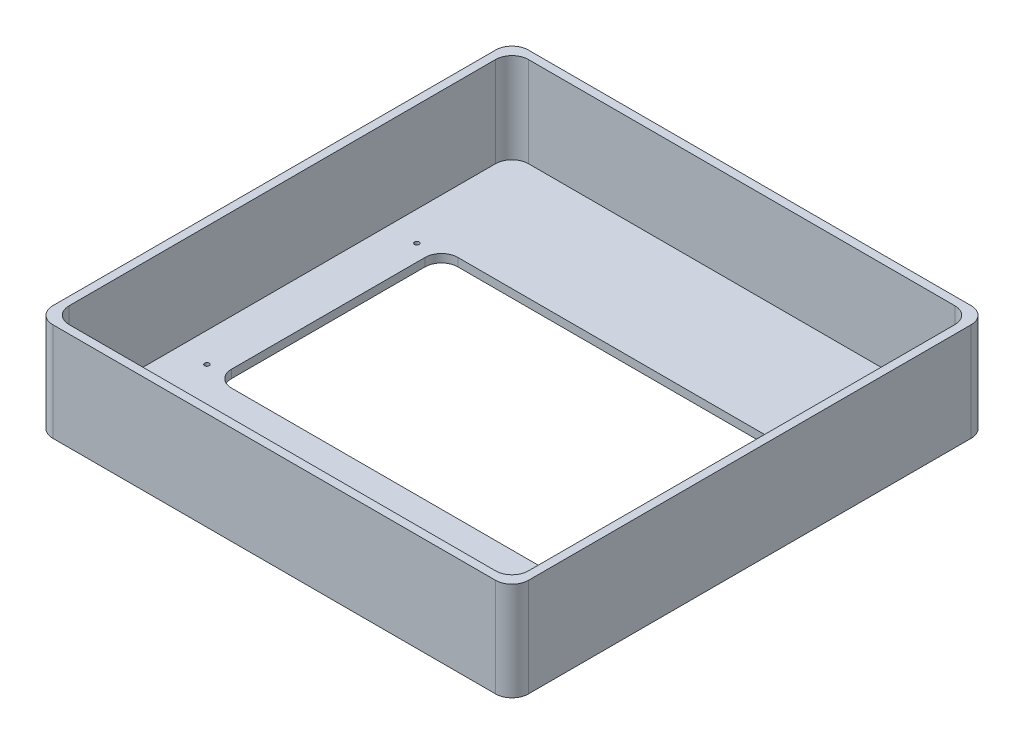
ISO-10303-21;
HEADER;
FILE_DESCRIPTION(('STEP AP214'),'2;1');
FILE_NAME('part.step','',(''),(''),'','','');
FILE_SCHEMA(('AUTOMOTIVE_DESIGN { 1 0 10303 214 1 1 1 1 }'));
ENDSEC;
DATA;
#1=APPLICATION_CONTEXT('core data for automotive mechanical design processes');
#2=APPLICATION_PROTOCOL_DEFINITION('international standard','automotive_design',2000,#1);
#3=PRODUCT_CONTEXT('',#1,'mechanical');
#4=PRODUCT('Part','Part','',(#3));
#5=PRODUCT_RELATED_PRODUCT_CATEGORY('part','',(#4));
#6=PRODUCT_DEFINITION_FORMATION('','',#4);
#7=PRODUCT_DEFINITION_CONTEXT('part definition',#1,'design');
#8=PRODUCT_DEFINITION('design','',#6,#7);
#9=PRODUCT_DEFINITION_SHAPE('','',#8);
#10=(LENGTH_UNIT() NAMED_UNIT(*) SI_UNIT(.MILLI.,.METRE.));
#11=(NAMED_UNIT(*) PLANE_ANGLE_UNIT() SI_UNIT($,.RADIAN.));
#12=(NAMED_UNIT(*) SI_UNIT($,.STERADIAN.) SOLID_ANGLE_UNIT());
#13=UNCERTAINTY_MEASURE_WITH_UNIT(LENGTH_MEASURE(1.E-05),#10,'distance_accuracy_value','');
#14=(GEOMETRIC_REPRESENTATION_CONTEXT(3) GLOBAL_UNCERTAINTY_ASSIGNED_CONTEXT((#13)) GLOBAL_UNIT_ASSIGNED_CONTEXT((#10,
#11,#12)) REPRESENTATION_CONTEXT('',''));
#15=CARTESIAN_POINT('',(0.,0.,0.));
#16=DIRECTION('',(0.,0.,1.));
#17=DIRECTION('',(1.,0.,0.));
#18=AXIS2_PLACEMENT_3D('',#15,#16,#17);
#19=CARTESIAN_POINT('',(0.,5.,0.));
#20=DIRECTION('',(0.,-1.,0.));
#21=DIRECTION('',(0.,0.,-1.));
#22=AXIS2_PLACEMENT_3D('',#19,#20,#21);
#23=PLANE('',#22);
#24=CARTESIAN_POINT('',(-122.,5.,-64.));
#25=DIRECTION('',(0.,-1.,0.));
#26=DIRECTION('',(0.,0.,-1.));
#27=AXIS2_PLACEMENT_3D('',#24,#25,#26);
#28=CIRCLE('',#27,1.4);
#29=CARTESIAN_POINT('',(-122.,5.,-65.4));
#30=VERTEX_POINT('',#29);
#31=EDGE_CURVE('E583',#30,#30,#28,.F.);
#32=ORIENTED_EDGE('',*,*,#31,.F.);
#33=EDGE_LOOP('',(#32));
#34=FACE_BOUND('',#33,.T.);
#35=CARTESIAN_POINT('',(122.,5.,-64.));
#36=DIRECTION('',(0.,-1.,0.));
#37=DIRECTION('',(0.,0.,-1.));
#38=AXIS2_PLACEMENT_3D('',#35,#36,#37);
#39=CIRCLE('',#38,1.4);
#40=CARTESIAN_POINT('',(122.,5.,-65.4));
#41=VERTEX_POINT('',#40);
#42=EDGE_CURVE('E582',#41,#41,#39,.F.);
#43=ORIENTED_EDGE('',*,*,#42,.F.);
#44=EDGE_LOOP('',(#43));
#45=FACE_BOUND('',#44,.T.);
#46=CARTESIAN_POINT('',(122.,5.,64.));
#47=DIRECTION('',(0.,-1.,0.));
#48=DIRECTION('',(0.,0.,-1.));
#49=AXIS2_PLACEMENT_3D('',#46,#47,#48);
#50=CIRCLE('',#49,1.4);
#51=CARTESIAN_POINT('',(122.,5.,62.6));
#52=VERTEX_POINT('',#51);
#53=EDGE_CURVE('E591',#52,#52,#50,.F.);
#54=ORIENTED_EDGE('',*,*,#53,.F.);
#55=EDGE_LOOP('',(#54));
#56=FACE_BOUND('',#55,.T.);
#57=CARTESIAN_POINT('',(-122.,5.,64.));
#58=DIRECTION('',(0.,-1.,0.));
#59=DIRECTION('',(0.,0.,-1.));
#60=AXIS2_PLACEMENT_3D('',#57,#58,#59);
#61=CIRCLE('',#60,1.4);
#62=CARTESIAN_POINT('',(-122.,5.,62.6));
#63=VERTEX_POINT('',#62);
#64=EDGE_CURVE('E397',#63,#63,#61,.F.);
#65=ORIENTED_EDGE('',*,*,#64,.F.);
#66=EDGE_LOOP('',(#65));
#67=FACE_BOUND('',#66,.T.);
#68=DIRECTION('',(-1.,0.,0.));
#69=VECTOR('',#68,1.);
#70=CARTESIAN_POINT('',(140.,5.,-140.));
#71=LINE('',#70,#69);
#72=CARTESIAN_POINT('',(130.,5.,-140.));
#73=VERTEX_POINT('',#72);
#74=CARTESIAN_POINT('',(-130.,5.,-140.));
#75=VERTEX_POINT('',#74);
#76=EDGE_CURVE('E446',#73,#75,#71,.T.);
#77=ORIENTED_EDGE('',*,*,#76,.T.);
#78=CARTESIAN_POINT('',(-130.,5.,-130.));
#79=DIRECTION('',(0.,-1.,0.));
#80=DIRECTION('',(0.,0.,-1.));
#81=AXIS2_PLACEMENT_3D('',#78,#79,#80);
#82=CIRCLE('',#81,10.);
#83=CARTESIAN_POINT('',(-140.,5.,-130.));
#84=VERTEX_POINT('',#83);
#85=EDGE_CURVE('E299',#75,#84,#82,.F.);
#86=ORIENTED_EDGE('',*,*,#85,.T.);
#87=DIRECTION('',(0.,0.,1.));
#88=VECTOR('',#87,1.);
#89=CARTESIAN_POINT('',(-140.,5.,-140.));
#90=LINE('',#89,#88);
#91=CARTESIAN_POINT('',(-140.,5.,130.));
#92=VERTEX_POINT('',#91);
#93=EDGE_CURVE('E451',#84,#92,#90,.T.);
#94=ORIENTED_EDGE('',*,*,#93,.T.);
#95=CARTESIAN_POINT('',(-130.,5.,130.));
#96=DIRECTION('',(0.,-1.,0.));
#97=DIRECTION('',(0.,0.,-1.));
#98=AXIS2_PLACEMENT_3D('',#95,#96,#97);
#99=CIRCLE('',#98,10.);
#100=CARTESIAN_POINT('',(-130.,5.,140.));
#101=VERTEX_POINT('',#100);
#102=EDGE_CURVE('E290',#92,#101,#99,.F.);
#103=ORIENTED_EDGE('',*,*,#102,.T.);
#104=DIRECTION('',(1.,0.,0.));
#105=VECTOR('',#104,1.);
#106=CARTESIAN_POINT('',(-140.,5.,140.));
#107=LINE('',#106,#105);
#108=CARTESIAN_POINT('',(130.,5.,140.));
#109=VERTEX_POINT('',#108);
#110=EDGE_CURVE('E447',#101,#109,#107,.T.);
#111=ORIENTED_EDGE('',*,*,#110,.T.);
#112=CARTESIAN_POINT('',(130.,5.,130.));
#113=DIRECTION('',(0.,-1.,0.));
#114=DIRECTION('',(0.,0.,-1.));
#115=AXIS2_PLACEMENT_3D('',#112,#113,#114);
#116=CIRCLE('',#115,10.);
#117=CARTESIAN_POINT('',(140.,5.,130.));
#118=VERTEX_POINT('',#117);
#119=EDGE_CURVE('E293',#109,#118,#116,.F.);
#120=ORIENTED_EDGE('',*,*,#119,.T.);
#121=DIRECTION('',(0.,0.,-1.));
#122=VECTOR('',#121,1.);
#123=CARTESIAN_POINT('',(140.,5.,140.));
#124=LINE('',#123,#122);
#125=CARTESIAN_POINT('',(140.,5.,-130.));
#126=VERTEX_POINT('',#125);
#127=EDGE_CURVE('E431',#118,#126,#124,.T.);
#128=ORIENTED_EDGE('',*,*,#127,.T.);
#129=CARTESIAN_POINT('',(130.,5.,-130.));
#130=DIRECTION('',(0.,-1.,0.));
#131=DIRECTION('',(0.,0.,-1.));
#132=AXIS2_PLACEMENT_3D('',#129,#130,#131);
#133=CIRCLE('',#132,10.);
#134=EDGE_CURVE('E296',#126,#73,#133,.F.);
#135=ORIENTED_EDGE('',*,*,#134,.T.);
#136=EDGE_LOOP('',(#77,#86,#94,#103,#111,#120,#128,#135));
#137=FACE_BOUND('',#136,.T.);
#138=DIRECTION('',(0.,0.,-1.));
#139=VECTOR('',#138,1.);
#140=CARTESIAN_POINT('',(112.,5.,69.));
#141=LINE('',#140,#139);
#142=CARTESIAN_POINT('',(112.,5.,59.));
#143=VERTEX_POINT('',#142);
#144=CARTESIAN_POINT('',(112.,5.,-59.));
#145=VERTEX_POINT('',#144);
#146=EDGE_CURVE('E389',#143,#145,#141,.T.);
#147=ORIENTED_EDGE('',*,*,#146,.F.);
#148=CARTESIAN_POINT('',(102.,5.,59.));
#149=DIRECTION('',(0.,-1.,0.));
#150=DIRECTION('',(0.,0.,-1.));
#151=AXIS2_PLACEMENT_3D('',#148,#149,#150);
#152=CIRCLE('',#151,10.);
#153=CARTESIAN_POINT('',(102.,5.,69.));
#154=VERTEX_POINT('',#153);
#155=EDGE_CURVE('E381',#143,#154,#152,.T.);
#156=ORIENTED_EDGE('',*,*,#155,.T.);
#157=DIRECTION('',(1.,0.,0.));
#158=VECTOR('',#157,1.);
#159=CARTESIAN_POINT('',(-112.,5.,69.));
#160=LINE('',#159,#158);
#161=CARTESIAN_POINT('',(-102.,5.,69.));
#162=VERTEX_POINT('',#161);
#163=EDGE_CURVE('E410',#162,#154,#160,.T.);
#164=ORIENTED_EDGE('',*,*,#163,.F.);
#165=CARTESIAN_POINT('',(-102.,5.,59.));
#166=DIRECTION('',(0.,-1.,0.));
#167=DIRECTION('',(0.,0.,-1.));
#168=AXIS2_PLACEMENT_3D('',#165,#166,#167);
#169=CIRCLE('',#168,10.);
#170=CARTESIAN_POINT('',(-112.,5.,59.));
#171=VERTEX_POINT('',#170);
#172=EDGE_CURVE('E375',#162,#171,#169,.T.);
#173=ORIENTED_EDGE('',*,*,#172,.T.);
#174=DIRECTION('',(0.,0.,1.));
#175=VECTOR('',#174,1.);
#176=CARTESIAN_POINT('',(-112.,5.,69.));
#177=LINE('',#176,#175);
#178=CARTESIAN_POINT('',(-112.,5.,-59.));
#179=VERTEX_POINT('',#178);
#180=EDGE_CURVE('E418',#179,#171,#177,.T.);
#181=ORIENTED_EDGE('',*,*,#180,.F.);
#182=CARTESIAN_POINT('',(-102.,5.,-59.));
#183=DIRECTION('',(0.,-1.,0.));
#184=DIRECTION('',(0.,0.,-1.));
#185=AXIS2_PLACEMENT_3D('',#182,#183,#184);
#186=CIRCLE('',#185,10.);
#187=CARTESIAN_POINT('',(-102.,5.,-69.));
#188=VERTEX_POINT('',#187);
#189=EDGE_CURVE('E369',#179,#188,#186,.T.);
#190=ORIENTED_EDGE('',*,*,#189,.T.);
#191=DIRECTION('',(-1.,0.,0.));
#192=VECTOR('',#191,1.);
#193=CARTESIAN_POINT('',(-112.,5.,-69.));
#194=LINE('',#193,#192);
#195=CARTESIAN_POINT('',(102.,5.,-69.));
#196=VERTEX_POINT('',#195);
#197=EDGE_CURVE('E391',#196,#188,#194,.T.);
#198=ORIENTED_EDGE('',*,*,#197,.F.);
#199=CARTESIAN_POINT('',(102.,5.,-59.));
#200=DIRECTION('',(0.,-1.,0.));
#201=DIRECTION('',(0.,0.,-1.));
#202=AXIS2_PLACEMENT_3D('',#199,#200,#201);
#203=CIRCLE('',#202,10.);
#204=EDGE_CURVE('E54',#196,#145,#203,.T.);
#205=ORIENTED_EDGE('',*,*,#204,.T.);
#206=EDGE_LOOP('',(#147,#156,#164,#173,#181,#190,#198,#205));
#207=FACE_BOUND('',#206,.T.);
#208=ADVANCED_FACE('F45',(#34,#45,#56,#67,#137,#207),#23,.F.);
#209=CARTESIAN_POINT('',(145.,60.,145.));
#210=DIRECTION('',(-1.,0.,0.));
#211=DIRECTION('',(0.,0.,1.));
#212=AXIS2_PLACEMENT_3D('',#209,#210,#211);
#213=PLANE('',#212);
#214=DIRECTION('',(0.,0.,-1.));
#215=VECTOR('',#214,1.);
#216=CARTESIAN_POINT('',(145.,0.,145.));
#217=LINE('',#216,#215);
#218=CARTESIAN_POINT('',(145.,0.,135.));
#219=VERTEX_POINT('',#218);
#220=CARTESIAN_POINT('',(145.,0.,-135.));
#221=VERTEX_POINT('',#220);
#222=EDGE_CURVE('E245',#219,#221,#217,.T.);
#223=ORIENTED_EDGE('',*,*,#222,.T.);
#224=DIRECTION('',(0.,-1.,0.));
#225=VECTOR('',#224,1.);
#226=CARTESIAN_POINT('',(145.,60.,-135.));
#227=LINE('',#226,#225);
#228=CARTESIAN_POINT('',(145.,60.,-135.));
#229=VERTEX_POINT('',#228);
#230=EDGE_CURVE('E306',#221,#229,#227,.F.);
#231=ORIENTED_EDGE('',*,*,#230,.T.);
#232=DIRECTION('',(0.,0.,-1.));
#233=VECTOR('',#232,1.);
#234=CARTESIAN_POINT('',(145.,60.,145.));
#235=LINE('',#234,#233);
#236=CARTESIAN_POINT('',(145.,60.,135.));
#237=VERTEX_POINT('',#236);
#238=EDGE_CURVE('E243',#237,#229,#235,.T.);
#239=ORIENTED_EDGE('',*,*,#238,.F.);
#240=DIRECTION('',(0.,-1.,0.));
#241=VECTOR('',#240,1.);
#242=CARTESIAN_POINT('',(145.,60.,135.));
#243=LINE('',#242,#241);
#244=EDGE_CURVE('E302',#237,#219,#243,.T.);
#245=ORIENTED_EDGE('',*,*,#244,.T.);
#246=EDGE_LOOP('',(#223,#231,#239,#245));
#247=FACE_BOUND('',#246,.T.);
#248=ADVANCED_FACE('F474',(#247),#213,.F.);
#249=CARTESIAN_POINT('',(-145.,60.,-145.));
#250=DIRECTION('',(0.,0.,1.));
#251=DIRECTION('',(1.,0.,0.));
#252=AXIS2_PLACEMENT_3D('',#249,#250,#251);
#253=PLANE('',#252);
#254=DIRECTION('',(-1.,0.,0.));
#255=VECTOR('',#254,1.);
#256=CARTESIAN_POINT('',(-145.,0.,-145.));
#257=LINE('',#256,#255);
#258=CARTESIAN_POINT('',(135.,0.,-145.));
#259=VERTEX_POINT('',#258);
#260=CARTESIAN_POINT('',(-135.,0.,-145.));
#261=VERTEX_POINT('',#260);
#262=EDGE_CURVE('E238',#259,#261,#257,.T.);
#263=ORIENTED_EDGE('',*,*,#262,.T.);
#264=DIRECTION('',(0.,-1.,0.));
#265=VECTOR('',#264,1.);
#266=CARTESIAN_POINT('',(-135.,60.,-145.));
#267=LINE('',#266,#265);
#268=CARTESIAN_POINT('',(-135.,60.,-145.));
#269=VERTEX_POINT('',#268);
#270=EDGE_CURVE('E213',#261,#269,#267,.F.);
#271=ORIENTED_EDGE('',*,*,#270,.T.);
#272=DIRECTION('',(-1.,0.,0.));
#273=VECTOR('',#272,1.);
#274=CARTESIAN_POINT('',(-145.,60.,-145.));
#275=LINE('',#274,#273);
#276=CARTESIAN_POINT('',(135.,60.,-145.));
#277=VERTEX_POINT('',#276);
#278=EDGE_CURVE('E461',#277,#269,#275,.T.);
#279=ORIENTED_EDGE('',*,*,#278,.F.);
#280=DIRECTION('',(0.,-1.,0.));
#281=VECTOR('',#280,1.);
#282=CARTESIAN_POINT('',(135.,60.,-145.));
#283=LINE('',#282,#281);
#284=EDGE_CURVE('E219',#277,#259,#283,.T.);
#285=ORIENTED_EDGE('',*,*,#284,.T.);
#286=EDGE_LOOP('',(#263,#271,#279,#285));
#287=FACE_BOUND('',#286,.T.);
#288=ADVANCED_FACE('F485',(#287),#253,.F.);
#289=CARTESIAN_POINT('',(-145.,60.,145.));
#290=DIRECTION('',(1.,0.,0.));
#291=DIRECTION('',(0.,0.,-1.));
#292=AXIS2_PLACEMENT_3D('',#289,#290,#291);
#293=PLANE('',#292);
#294=DIRECTION('',(0.,0.,1.));
#295=VECTOR('',#294,1.);
#296=CARTESIAN_POINT('',(-145.,60.,145.));
#297=LINE('',#296,#295);
#298=CARTESIAN_POINT('',(-145.,60.,-135.));
#299=VERTEX_POINT('',#298);
#300=CARTESIAN_POINT('',(-145.,60.,135.));
#301=VERTEX_POINT('',#300);
#302=EDGE_CURVE('E229',#299,#301,#297,.T.);
#303=ORIENTED_EDGE('',*,*,#302,.F.);
#304=DIRECTION('',(0.,-1.,0.));
#305=VECTOR('',#304,1.);
#306=CARTESIAN_POINT('',(-145.,60.,-135.));
#307=LINE('',#306,#305);
#308=CARTESIAN_POINT('',(-145.,0.,-135.));
#309=VERTEX_POINT('',#308);
#310=EDGE_CURVE('E212',#299,#309,#307,.T.);
#311=ORIENTED_EDGE('',*,*,#310,.T.);
#312=DIRECTION('',(0.,0.,1.));
#313=VECTOR('',#312,1.);
#314=CARTESIAN_POINT('',(-145.,0.,145.));
#315=LINE('',#314,#313);
#316=CARTESIAN_POINT('',(-145.,0.,135.));
#317=VERTEX_POINT('',#316);
#318=EDGE_CURVE('E226',#309,#317,#315,.T.);
#319=ORIENTED_EDGE('',*,*,#318,.T.);
#320=DIRECTION('',(0.,-1.,0.));
#321=VECTOR('',#320,1.);
#322=CARTESIAN_POINT('',(-145.,60.,135.));
#323=LINE('',#322,#321);
#324=EDGE_CURVE('E232',#317,#301,#323,.F.);
#325=ORIENTED_EDGE('',*,*,#324,.T.);
#326=EDGE_LOOP('',(#303,#311,#319,#325));
#327=FACE_BOUND('',#326,.T.);
#328=ADVANCED_FACE('F225',(#327),#293,.F.);
#329=CARTESIAN_POINT('',(-145.,60.,145.));
#330=DIRECTION('',(0.,0.,-1.));
#331=DIRECTION('',(-1.,0.,0.));
#332=AXIS2_PLACEMENT_3D('',#329,#330,#331);
#333=PLANE('',#332);
#334=DIRECTION('',(1.,0.,0.));
#335=VECTOR('',#334,1.);
#336=CARTESIAN_POINT('',(-145.,0.,145.));
#337=LINE('',#336,#335);
#338=CARTESIAN_POINT('',(-135.,0.,145.));
#339=VERTEX_POINT('',#338);
#340=CARTESIAN_POINT('',(135.,0.,145.));
#341=VERTEX_POINT('',#340);
#342=EDGE_CURVE('E237',#339,#341,#337,.T.);
#343=ORIENTED_EDGE('',*,*,#342,.T.);
#344=DIRECTION('',(0.,-1.,0.));
#345=VECTOR('',#344,1.);
#346=CARTESIAN_POINT('',(135.,60.,145.));
#347=LINE('',#346,#345);
#348=CARTESIAN_POINT('',(135.,60.,145.));
#349=VERTEX_POINT('',#348);
#350=EDGE_CURVE('E320',#341,#349,#347,.F.);
#351=ORIENTED_EDGE('',*,*,#350,.T.);
#352=DIRECTION('',(1.,0.,0.));
#353=VECTOR('',#352,1.);
#354=CARTESIAN_POINT('',(-145.,60.,145.));
#355=LINE('',#354,#353);
#356=CARTESIAN_POINT('',(-135.,60.,145.));
#357=VERTEX_POINT('',#356);
#358=EDGE_CURVE('E250',#357,#349,#355,.T.);
#359=ORIENTED_EDGE('',*,*,#358,.F.);
#360=DIRECTION('',(0.,-1.,0.));
#361=VECTOR('',#360,1.);
#362=CARTESIAN_POINT('',(-135.,60.,145.));
#363=LINE('',#362,#361);
#364=EDGE_CURVE('E316',#357,#339,#363,.T.);
#365=ORIENTED_EDGE('',*,*,#364,.T.);
#366=EDGE_LOOP('',(#343,#351,#359,#365));
#367=FACE_BOUND('',#366,.T.);
#368=ADVANCED_FACE('F492',(#367),#333,.F.);
#369=CARTESIAN_POINT('',(0.,60.,0.));
#370=DIRECTION('',(0.,-1.,0.));
#371=DIRECTION('',(0.,0.,-1.));
#372=AXIS2_PLACEMENT_3D('',#369,#370,#371);
#373=PLANE('',#372);
#374=DIRECTION('',(-1.,0.,0.));
#375=VECTOR('',#374,1.);
#376=CARTESIAN_POINT('',(140.,60.,-140.));
#377=LINE('',#376,#375);
#378=CARTESIAN_POINT('',(130.,60.,-140.));
#379=VERTEX_POINT('',#378);
#380=CARTESIAN_POINT('',(-130.,60.,-140.));
#381=VERTEX_POINT('',#380);
#382=EDGE_CURVE('E432',#379,#381,#377,.T.);
#383=ORIENTED_EDGE('',*,*,#382,.F.);
#384=CARTESIAN_POINT('',(130.,60.,-130.));
#385=DIRECTION('',(0.,-1.,0.));
#386=DIRECTION('',(0.,0.,-1.));
#387=AXIS2_PLACEMENT_3D('',#384,#385,#386);
#388=CIRCLE('',#387,10.);
#389=CARTESIAN_POINT('',(140.,60.,-130.));
#390=VERTEX_POINT('',#389);
#391=EDGE_CURVE('E333',#379,#390,#388,.T.);
#392=ORIENTED_EDGE('',*,*,#391,.T.);
#393=DIRECTION('',(0.,0.,-1.));
#394=VECTOR('',#393,1.);
#395=CARTESIAN_POINT('',(140.,60.,140.));
#396=LINE('',#395,#394);
#397=CARTESIAN_POINT('',(140.,60.,130.));
#398=VERTEX_POINT('',#397);
#399=EDGE_CURVE('E436',#398,#390,#396,.T.);
#400=ORIENTED_EDGE('',*,*,#399,.F.);
#401=CARTESIAN_POINT('',(130.,60.,130.));
#402=DIRECTION('',(0.,-1.,0.));
#403=DIRECTION('',(0.,0.,-1.));
#404=AXIS2_PLACEMENT_3D('',#401,#402,#403);
#405=CIRCLE('',#404,10.);
#406=CARTESIAN_POINT('',(130.,60.,140.));
#407=VERTEX_POINT('',#406);
#408=EDGE_CURVE('E336',#398,#407,#405,.T.);
#409=ORIENTED_EDGE('',*,*,#408,.T.);
#410=DIRECTION('',(1.,0.,0.));
#411=VECTOR('',#410,1.);
#412=CARTESIAN_POINT('',(-140.,60.,140.));
#413=LINE('',#412,#411);
#414=CARTESIAN_POINT('',(-130.,60.,140.));
#415=VERTEX_POINT('',#414);
#416=EDGE_CURVE('E424',#415,#407,#413,.T.);
#417=ORIENTED_EDGE('',*,*,#416,.F.);
#418=CARTESIAN_POINT('',(-130.,60.,130.));
#419=DIRECTION('',(0.,-1.,0.));
#420=DIRECTION('',(0.,0.,-1.));
#421=AXIS2_PLACEMENT_3D('',#418,#419,#420);
#422=CIRCLE('',#421,10.);
#423=CARTESIAN_POINT('',(-140.,60.,130.));
#424=VERTEX_POINT('',#423);
#425=EDGE_CURVE('E339',#415,#424,#422,.T.);
#426=ORIENTED_EDGE('',*,*,#425,.T.);
#427=DIRECTION('',(0.,0.,1.));
#428=VECTOR('',#427,1.);
#429=CARTESIAN_POINT('',(-140.,60.,-140.));
#430=LINE('',#429,#428);
#431=CARTESIAN_POINT('',(-140.,60.,-130.));
#432=VERTEX_POINT('',#431);
#433=EDGE_CURVE('E427',#432,#424,#430,.T.);
#434=ORIENTED_EDGE('',*,*,#433,.F.);
#435=CARTESIAN_POINT('',(-130.,60.,-130.));
#436=DIRECTION('',(0.,-1.,0.));
#437=DIRECTION('',(0.,0.,-1.));
#438=AXIS2_PLACEMENT_3D('',#435,#436,#437);
#439=CIRCLE('',#438,10.);
#440=EDGE_CURVE('E330',#432,#381,#439,.T.);
#441=ORIENTED_EDGE('',*,*,#440,.T.);
#442=EDGE_LOOP('',(#383,#392,#400,#409,#417,#426,#434,#441));
#443=FACE_BOUND('',#442,.T.);
#444=ORIENTED_EDGE('',*,*,#278,.T.);
#445=CARTESIAN_POINT('',(-135.,60.,-135.));
#446=DIRECTION('',(0.,-1.,0.));
#447=DIRECTION('',(0.,0.,-1.));
#448=AXIS2_PLACEMENT_3D('',#445,#446,#447);
#449=CIRCLE('',#448,10.);
#450=EDGE_CURVE('E273',#269,#299,#449,.F.);
#451=ORIENTED_EDGE('',*,*,#450,.T.);
#452=ORIENTED_EDGE('',*,*,#302,.T.);
#453=CARTESIAN_POINT('',(-135.,60.,135.));
#454=DIRECTION('',(0.,-1.,0.));
#455=DIRECTION('',(0.,0.,-1.));
#456=AXIS2_PLACEMENT_3D('',#453,#454,#455);
#457=CIRCLE('',#456,10.);
#458=EDGE_CURVE('E264',#301,#357,#457,.F.);
#459=ORIENTED_EDGE('',*,*,#458,.T.);
#460=ORIENTED_EDGE('',*,*,#358,.T.);
#461=CARTESIAN_POINT('',(135.,60.,135.));
#462=DIRECTION('',(0.,-1.,0.));
#463=DIRECTION('',(0.,0.,-1.));
#464=AXIS2_PLACEMENT_3D('',#461,#462,#463);
#465=CIRCLE('',#464,10.);
#466=EDGE_CURVE('E267',#349,#237,#465,.F.);
#467=ORIENTED_EDGE('',*,*,#466,.T.);
#468=ORIENTED_EDGE('',*,*,#238,.T.);
#469=CARTESIAN_POINT('',(135.,60.,-135.));
#470=DIRECTION('',(0.,-1.,0.));
#471=DIRECTION('',(0.,0.,-1.));
#472=AXIS2_PLACEMENT_3D('',#469,#470,#471);
#473=CIRCLE('',#472,10.);
#474=EDGE_CURVE('E270',#229,#277,#473,.F.);
#475=ORIENTED_EDGE('',*,*,#474,.T.);
#476=EDGE_LOOP('',(#444,#451,#452,#459,#460,#467,#468,#475));
#477=FACE_BOUND('',#476,.T.);
#478=ADVANCED_FACE('F483',(#443,#477),#373,.F.);
#479=CARTESIAN_POINT('',(0.,0.,0.));
#480=DIRECTION('',(0.,-1.,0.));
#481=DIRECTION('',(0.,0.,-1.));
#482=AXIS2_PLACEMENT_3D('',#479,#480,#481);
#483=PLANE('',#482);
#484=CARTESIAN_POINT('',(-122.,0.,-64.));
#485=DIRECTION('',(0.,-1.,0.));
#486=DIRECTION('',(0.,0.,1.));
#487=AXIS2_PLACEMENT_3D('',#484,#485,#486);
#488=CIRCLE('',#487,1.4);
#489=CARTESIAN_POINT('',(-122.,0.,-62.6));
#490=VERTEX_POINT('',#489);
#491=EDGE_CURVE('E578',#490,#490,#488,.T.);
#492=ORIENTED_EDGE('',*,*,#491,.F.);
#493=EDGE_LOOP('',(#492));
#494=FACE_BOUND('',#493,.T.);
#495=CARTESIAN_POINT('',(122.,0.,-64.));
#496=DIRECTION('',(0.,-1.,0.));
#497=DIRECTION('',(0.,0.,-1.));
#498=AXIS2_PLACEMENT_3D('',#495,#496,#497);
#499=CIRCLE('',#498,1.4);
#500=CARTESIAN_POINT('',(122.,0.,-65.4));
#501=VERTEX_POINT('',#500);
#502=EDGE_CURVE('E587',#501,#501,#499,.T.);
#503=ORIENTED_EDGE('',*,*,#502,.F.);
#504=EDGE_LOOP('',(#503));
#505=FACE_BOUND('',#504,.T.);
#506=CARTESIAN_POINT('',(122.,0.,64.));
#507=DIRECTION('',(0.,-1.,0.));
#508=DIRECTION('',(0.,0.,1.));
#509=AXIS2_PLACEMENT_3D('',#506,#507,#508);
#510=CIRCLE('',#509,1.4);
#511=CARTESIAN_POINT('',(122.,0.,65.4));
#512=VERTEX_POINT('',#511);
#513=EDGE_CURVE('E577',#512,#512,#510,.T.);
#514=ORIENTED_EDGE('',*,*,#513,.F.);
#515=EDGE_LOOP('',(#514));
#516=FACE_BOUND('',#515,.T.);
#517=CARTESIAN_POINT('',(-122.,0.,64.));
#518=DIRECTION('',(0.,-1.,0.));
#519=DIRECTION('',(0.,0.,-1.));
#520=AXIS2_PLACEMENT_3D('',#517,#518,#519);
#521=CIRCLE('',#520,1.4);
#522=CARTESIAN_POINT('',(-122.,0.,62.6));
#523=VERTEX_POINT('',#522);
#524=EDGE_CURVE('E573',#523,#523,#521,.T.);
#525=ORIENTED_EDGE('',*,*,#524,.F.);
#526=EDGE_LOOP('',(#525));
#527=FACE_BOUND('',#526,.T.);
#528=DIRECTION('',(0.,0.,-1.));
#529=VECTOR('',#528,1.);
#530=CARTESIAN_POINT('',(112.,0.,69.));
#531=LINE('',#530,#529);
#532=CARTESIAN_POINT('',(112.,0.,59.));
#533=VERTEX_POINT('',#532);
#534=CARTESIAN_POINT('',(112.,0.,-59.));
#535=VERTEX_POINT('',#534);
#536=EDGE_CURVE('E404',#533,#535,#531,.T.);
#537=ORIENTED_EDGE('',*,*,#536,.T.);
#538=CARTESIAN_POINT('',(102.,0.,-59.));
#539=DIRECTION('',(0.,-1.,0.));
#540=DIRECTION('',(0.,0.,-1.));
#541=AXIS2_PLACEMENT_3D('',#538,#539,#540);
#542=CIRCLE('',#541,10.);
#543=CARTESIAN_POINT('',(102.,0.,-69.));
#544=VERTEX_POINT('',#543);
#545=EDGE_CURVE('E12',#535,#544,#542,.F.);
#546=ORIENTED_EDGE('',*,*,#545,.T.);
#547=DIRECTION('',(-1.,0.,0.));
#548=VECTOR('',#547,1.);
#549=CARTESIAN_POINT('',(-112.,0.,-69.));
#550=LINE('',#549,#548);
#551=CARTESIAN_POINT('',(-102.,0.,-69.));
#552=VERTEX_POINT('',#551);
#553=EDGE_CURVE('E402',#544,#552,#550,.T.);
#554=ORIENTED_EDGE('',*,*,#553,.T.);
#555=CARTESIAN_POINT('',(-102.,0.,-59.));
#556=DIRECTION('',(0.,-1.,0.));
#557=DIRECTION('',(0.,0.,-1.));
#558=AXIS2_PLACEMENT_3D('',#555,#556,#557);
#559=CIRCLE('',#558,10.);
#560=CARTESIAN_POINT('',(-112.,0.,-59.));
#561=VERTEX_POINT('',#560);
#562=EDGE_CURVE('E372',#552,#561,#559,.F.);
#563=ORIENTED_EDGE('',*,*,#562,.T.);
#564=DIRECTION('',(0.,0.,1.));
#565=VECTOR('',#564,1.);
#566=CARTESIAN_POINT('',(-112.,0.,69.));
#567=LINE('',#566,#565);
#568=CARTESIAN_POINT('',(-112.,0.,59.));
#569=VERTEX_POINT('',#568);
#570=EDGE_CURVE('E409',#561,#569,#567,.T.);
#571=ORIENTED_EDGE('',*,*,#570,.T.);
#572=CARTESIAN_POINT('',(-102.,0.,59.));
#573=DIRECTION('',(0.,-1.,0.));
#574=DIRECTION('',(0.,0.,-1.));
#575=AXIS2_PLACEMENT_3D('',#572,#573,#574);
#576=CIRCLE('',#575,10.);
#577=CARTESIAN_POINT('',(-102.,0.,69.));
#578=VERTEX_POINT('',#577);
#579=EDGE_CURVE('E378',#569,#578,#576,.F.);
#580=ORIENTED_EDGE('',*,*,#579,.T.);
#581=DIRECTION('',(1.,0.,0.));
#582=VECTOR('',#581,1.);
#583=CARTESIAN_POINT('',(-112.,0.,69.));
#584=LINE('',#583,#582);
#585=CARTESIAN_POINT('',(102.,0.,69.));
#586=VERTEX_POINT('',#585);
#587=EDGE_CURVE('E415',#578,#586,#584,.T.);
#588=ORIENTED_EDGE('',*,*,#587,.T.);
#589=CARTESIAN_POINT('',(102.,0.,59.));
#590=DIRECTION('',(0.,-1.,0.));
#591=DIRECTION('',(0.,0.,-1.));
#592=AXIS2_PLACEMENT_3D('',#589,#590,#591);
#593=CIRCLE('',#592,10.);
#594=EDGE_CURVE('E68',#586,#533,#593,.F.);
#595=ORIENTED_EDGE('',*,*,#594,.T.);
#596=EDGE_LOOP('',(#537,#546,#554,#563,#571,#580,#588,#595));
#597=FACE_BOUND('',#596,.T.);
#598=ORIENTED_EDGE('',*,*,#318,.F.);
#599=CARTESIAN_POINT('',(-135.,0.,-135.));
#600=DIRECTION('',(0.,-1.,0.));
#601=DIRECTION('',(0.,0.,-1.));
#602=AXIS2_PLACEMENT_3D('',#599,#600,#601);
#603=CIRCLE('',#602,10.);
#604=EDGE_CURVE('E208',#309,#261,#603,.T.);
#605=ORIENTED_EDGE('',*,*,#604,.T.);
#606=ORIENTED_EDGE('',*,*,#262,.F.);
#607=CARTESIAN_POINT('',(135.,0.,-135.));
#608=DIRECTION('',(0.,-1.,0.));
#609=DIRECTION('',(0.,0.,-1.));
#610=AXIS2_PLACEMENT_3D('',#607,#608,#609);
#611=CIRCLE('',#610,10.);
#612=EDGE_CURVE('E220',#259,#221,#611,.T.);
#613=ORIENTED_EDGE('',*,*,#612,.T.);
#614=ORIENTED_EDGE('',*,*,#222,.F.);
#615=CARTESIAN_POINT('',(135.,0.,135.));
#616=DIRECTION('',(0.,-1.,0.));
#617=DIRECTION('',(0.,0.,-1.));
#618=AXIS2_PLACEMENT_3D('',#615,#616,#617);
#619=CIRCLE('',#618,10.);
#620=EDGE_CURVE('E254',#219,#341,#619,.T.);
#621=ORIENTED_EDGE('',*,*,#620,.T.);
#622=ORIENTED_EDGE('',*,*,#342,.F.);
#623=CARTESIAN_POINT('',(-135.,0.,135.));
#624=DIRECTION('',(0.,-1.,0.));
#625=DIRECTION('',(0.,0.,-1.));
#626=AXIS2_PLACEMENT_3D('',#623,#624,#625);
#627=CIRCLE('',#626,10.);
#628=EDGE_CURVE('E231',#339,#317,#627,.T.);
#629=ORIENTED_EDGE('',*,*,#628,.T.);
#630=EDGE_LOOP('',(#598,#605,#606,#613,#614,#621,#622,#629));
#631=FACE_BOUND('',#630,.T.);
#632=ADVANCED_FACE('F234',(#494,#505,#516,#527,#597,#631),#483,.T.);
#633=CARTESIAN_POINT('',(140.,-395.979797464467,140.));
#634=DIRECTION('',(1.,0.,0.));
#635=DIRECTION('',(0.,0.,-1.));
#636=AXIS2_PLACEMENT_3D('',#633,#634,#635);
#637=PLANE('',#636);
#638=ORIENTED_EDGE('',*,*,#399,.T.);
#639=DIRECTION('',(0.,1.,0.));
#640=VECTOR('',#639,1.);
#641=CARTESIAN_POINT('',(140.,4.99999999999989,-130.));
#642=LINE('',#641,#640);
#643=EDGE_CURVE('E313',#390,#126,#642,.F.);
#644=ORIENTED_EDGE('',*,*,#643,.T.);
#645=ORIENTED_EDGE('',*,*,#127,.F.);
#646=DIRECTION('',(0.,1.,0.));
#647=VECTOR('',#646,1.);
#648=CARTESIAN_POINT('',(140.,60.,130.));
#649=LINE('',#648,#647);
#650=EDGE_CURVE('E309',#118,#398,#649,.T.);
#651=ORIENTED_EDGE('',*,*,#650,.T.);
#652=EDGE_LOOP('',(#638,#644,#645,#651));
#653=FACE_BOUND('',#652,.T.);
#654=ADVANCED_FACE('F504',(#653),#637,.F.);
#655=CARTESIAN_POINT('',(140.,-395.979797464467,-140.));
#656=DIRECTION('',(0.,0.,-1.));
#657=DIRECTION('',(-1.,0.,0.));
#658=AXIS2_PLACEMENT_3D('',#655,#656,#657);
#659=PLANE('',#658);
#660=ORIENTED_EDGE('',*,*,#382,.T.);
#661=DIRECTION('',(0.,1.,0.));
#662=VECTOR('',#661,1.);
#663=CARTESIAN_POINT('',(-130.,5.,-140.));
#664=LINE('',#663,#662);
#665=EDGE_CURVE('E287',#381,#75,#664,.F.);
#666=ORIENTED_EDGE('',*,*,#665,.T.);
#667=ORIENTED_EDGE('',*,*,#76,.F.);
#668=DIRECTION('',(0.,1.,0.));
#669=VECTOR('',#668,1.);
#670=CARTESIAN_POINT('',(130.,60.,-140.));
#671=LINE('',#670,#669);
#672=EDGE_CURVE('E283',#73,#379,#671,.T.);
#673=ORIENTED_EDGE('',*,*,#672,.T.);
#674=EDGE_LOOP('',(#660,#666,#667,#673));
#675=FACE_BOUND('',#674,.T.);
#676=ADVANCED_FACE('F638',(#675),#659,.F.);
#677=CARTESIAN_POINT('',(-140.,-395.979797464467,-140.));
#678=DIRECTION('',(-1.,0.,0.));
#679=DIRECTION('',(0.,0.,1.));
#680=AXIS2_PLACEMENT_3D('',#677,#678,#679);
#681=PLANE('',#680);
#682=ORIENTED_EDGE('',*,*,#93,.F.);
#683=DIRECTION('',(0.,1.,0.));
#684=VECTOR('',#683,1.);
#685=CARTESIAN_POINT('',(-140.,60.,-130.));
#686=LINE('',#685,#684);
#687=EDGE_CURVE('E279',#84,#432,#686,.T.);
#688=ORIENTED_EDGE('',*,*,#687,.T.);
#689=ORIENTED_EDGE('',*,*,#433,.T.);
#690=DIRECTION('',(0.,1.,0.));
#691=VECTOR('',#690,1.);
#692=CARTESIAN_POINT('',(-140.,5.,130.));
#693=LINE('',#692,#691);
#694=EDGE_CURVE('E276',#424,#92,#693,.F.);
#695=ORIENTED_EDGE('',*,*,#694,.T.);
#696=EDGE_LOOP('',(#682,#688,#689,#695));
#697=FACE_BOUND('',#696,.T.);
#698=ADVANCED_FACE('F620',(#697),#681,.F.);
#699=CARTESIAN_POINT('',(-140.,-395.979797464467,140.));
#700=DIRECTION('',(0.,0.,1.));
#701=DIRECTION('',(1.,0.,0.));
#702=AXIS2_PLACEMENT_3D('',#699,#700,#701);
#703=PLANE('',#702);
#704=ORIENTED_EDGE('',*,*,#416,.T.);
#705=DIRECTION('',(0.,1.,0.));
#706=VECTOR('',#705,1.);
#707=CARTESIAN_POINT('',(130.,5.,140.));
#708=LINE('',#707,#706);
#709=EDGE_CURVE('E327',#407,#109,#708,.F.);
#710=ORIENTED_EDGE('',*,*,#709,.T.);
#711=ORIENTED_EDGE('',*,*,#110,.F.);
#712=DIRECTION('',(0.,1.,0.));
#713=VECTOR('',#712,1.);
#714=CARTESIAN_POINT('',(-130.,60.,140.));
#715=LINE('',#714,#713);
#716=EDGE_CURVE('E323',#101,#415,#715,.T.);
#717=ORIENTED_EDGE('',*,*,#716,.T.);
#718=EDGE_LOOP('',(#704,#710,#711,#717));
#719=FACE_BOUND('',#718,.T.);
#720=ADVANCED_FACE('F628',(#719),#703,.F.);
#721=CARTESIAN_POINT('',(-112.,-263.096940309081,-69.));
#722=DIRECTION('',(0.,0.,-1.));
#723=DIRECTION('',(-1.,0.,0.));
#724=AXIS2_PLACEMENT_3D('',#721,#722,#723);
#725=PLANE('',#724);
#726=ORIENTED_EDGE('',*,*,#197,.T.);
#727=DIRECTION('',(0.,1.,0.));
#728=VECTOR('',#727,1.);
#729=CARTESIAN_POINT('',(-102.,0.,-69.));
#730=LINE('',#729,#728);
#731=EDGE_CURVE('E353',#188,#552,#730,.F.);
#732=ORIENTED_EDGE('',*,*,#731,.T.);
#733=ORIENTED_EDGE('',*,*,#553,.F.);
#734=DIRECTION('',(0.,1.,0.));
#735=VECTOR('',#734,1.);
#736=CARTESIAN_POINT('',(102.,5.,-69.));
#737=LINE('',#736,#735);
#738=EDGE_CURVE('E349',#544,#196,#737,.T.);
#739=ORIENTED_EDGE('',*,*,#738,.T.);
#740=EDGE_LOOP('',(#726,#732,#733,#739));
#741=FACE_BOUND('',#740,.T.);
#742=ADVANCED_FACE('F406',(#741),#725,.F.);
#743=CARTESIAN_POINT('',(-112.,-263.096940309081,69.));
#744=DIRECTION('',(-1.,0.,0.));
#745=DIRECTION('',(0.,0.,1.));
#746=AXIS2_PLACEMENT_3D('',#743,#744,#745);
#747=PLANE('',#746);
#748=ORIENTED_EDGE('',*,*,#570,.F.);
#749=DIRECTION('',(0.,1.,0.));
#750=VECTOR('',#749,1.);
#751=CARTESIAN_POINT('',(-112.,5.,-59.));
#752=LINE('',#751,#750);
#753=EDGE_CURVE('E345',#561,#179,#752,.T.);
#754=ORIENTED_EDGE('',*,*,#753,.T.);
#755=ORIENTED_EDGE('',*,*,#180,.T.);
#756=DIRECTION('',(0.,1.,0.));
#757=VECTOR('',#756,1.);
#758=CARTESIAN_POINT('',(-112.,0.,59.));
#759=LINE('',#758,#757);
#760=EDGE_CURVE('E342',#171,#569,#759,.F.);
#761=ORIENTED_EDGE('',*,*,#760,.T.);
#762=EDGE_LOOP('',(#748,#754,#755,#761));
#763=FACE_BOUND('',#762,.T.);
#764=ADVANCED_FACE('F564',(#763),#747,.F.);
#765=CARTESIAN_POINT('',(-112.,-263.096940309081,69.));
#766=DIRECTION('',(0.,0.,1.));
#767=DIRECTION('',(1.,0.,0.));
#768=AXIS2_PLACEMENT_3D('',#765,#766,#767);
#769=PLANE('',#768);
#770=ORIENTED_EDGE('',*,*,#587,.F.);
#771=DIRECTION('',(0.,1.,0.));
#772=VECTOR('',#771,1.);
#773=CARTESIAN_POINT('',(-102.,5.,69.));
#774=LINE('',#773,#772);
#775=EDGE_CURVE('E359',#578,#162,#774,.T.);
#776=ORIENTED_EDGE('',*,*,#775,.T.);
#777=ORIENTED_EDGE('',*,*,#163,.T.);
#778=DIRECTION('',(0.,1.,0.));
#779=VECTOR('',#778,1.);
#780=CARTESIAN_POINT('',(102.,0.,69.));
#781=LINE('',#780,#779);
#782=EDGE_CURVE('E356',#154,#586,#781,.F.);
#783=ORIENTED_EDGE('',*,*,#782,.T.);
#784=EDGE_LOOP('',(#770,#776,#777,#783));
#785=FACE_BOUND('',#784,.T.);
#786=ADVANCED_FACE('F556',(#785),#769,.F.);
#787=CARTESIAN_POINT('',(112.,-263.096940309081,69.));
#788=DIRECTION('',(1.,0.,0.));
#789=DIRECTION('',(0.,0.,-1.));
#790=AXIS2_PLACEMENT_3D('',#787,#788,#789);
#791=PLANE('',#790);
#792=ORIENTED_EDGE('',*,*,#536,.F.);
#793=DIRECTION('',(0.,1.,0.));
#794=VECTOR('',#793,1.);
#795=CARTESIAN_POINT('',(112.,5.,59.));
#796=LINE('',#795,#794);
#797=EDGE_CURVE('E365',#533,#143,#796,.T.);
#798=ORIENTED_EDGE('',*,*,#797,.T.);
#799=ORIENTED_EDGE('',*,*,#146,.T.);
#800=DIRECTION('',(0.,1.,0.));
#801=VECTOR('',#800,1.);
#802=CARTESIAN_POINT('',(112.,0.,-59.));
#803=LINE('',#802,#801);
#804=EDGE_CURVE('E61',#145,#535,#803,.F.);
#805=ORIENTED_EDGE('',*,*,#804,.T.);
#806=EDGE_LOOP('',(#792,#798,#799,#805));
#807=FACE_BOUND('',#806,.T.);
#808=ADVANCED_FACE('F394',(#807),#791,.F.);
#809=CARTESIAN_POINT('',(-122.,8.95979797464466,64.));
#810=DIRECTION('',(0.,-1.,0.));
#811=DIRECTION('',(0.,0.,-1.));
#812=AXIS2_PLACEMENT_3D('',#809,#810,#811);
#813=CYLINDRICAL_SURFACE('',#812,1.4);
#814=ORIENTED_EDGE('',*,*,#64,.T.);
#815=EDGE_LOOP('',(#814));
#816=FACE_BOUND('',#815,.T.);
#817=ORIENTED_EDGE('',*,*,#524,.T.);
#818=EDGE_LOOP('',(#817));
#819=FACE_BOUND('',#818,.T.);
#820=ADVANCED_FACE('F656',(#816,#819),#813,.F.);
#821=CARTESIAN_POINT('',(122.,8.95979797464466,64.));
#822=DIRECTION('',(0.,-1.,0.));
#823=DIRECTION('',(0.,0.,-1.));
#824=AXIS2_PLACEMENT_3D('',#821,#822,#823);
#825=CYLINDRICAL_SURFACE('',#824,1.4);
#826=ORIENTED_EDGE('',*,*,#53,.T.);
#827=EDGE_LOOP('',(#826));
#828=FACE_BOUND('',#827,.T.);
#829=ORIENTED_EDGE('',*,*,#513,.T.);
#830=EDGE_LOOP('',(#829));
#831=FACE_BOUND('',#830,.T.);
#832=ADVANCED_FACE('F602',(#828,#831),#825,.F.);
#833=CARTESIAN_POINT('',(122.,8.95979797464466,-64.));
#834=DIRECTION('',(0.,-1.,0.));
#835=DIRECTION('',(0.,0.,-1.));
#836=AXIS2_PLACEMENT_3D('',#833,#834,#835);
#837=CYLINDRICAL_SURFACE('',#836,1.4);
#838=ORIENTED_EDGE('',*,*,#42,.T.);
#839=EDGE_LOOP('',(#838));
#840=FACE_BOUND('',#839,.T.);
#841=ORIENTED_EDGE('',*,*,#502,.T.);
#842=EDGE_LOOP('',(#841));
#843=FACE_BOUND('',#842,.T.);
#844=ADVANCED_FACE('F663',(#840,#843),#837,.F.);
#845=CARTESIAN_POINT('',(-122.,8.95979797464466,-64.));
#846=DIRECTION('',(0.,-1.,0.));
#847=DIRECTION('',(0.,0.,-1.));
#848=AXIS2_PLACEMENT_3D('',#845,#846,#847);
#849=CYLINDRICAL_SURFACE('',#848,1.4);
#850=ORIENTED_EDGE('',*,*,#31,.T.);
#851=EDGE_LOOP('',(#850));
#852=FACE_BOUND('',#851,.T.);
#853=ORIENTED_EDGE('',*,*,#491,.T.);
#854=EDGE_LOOP('',(#853));
#855=FACE_BOUND('',#854,.T.);
#856=ADVANCED_FACE('F660',(#852,#855),#849,.F.);
#857=CARTESIAN_POINT('',(-135.,60.,-135.));
#858=DIRECTION('',(0.,-1.,0.));
#859=DIRECTION('',(0.,0.,-1.));
#860=AXIS2_PLACEMENT_3D('',#857,#858,#859);
#861=CYLINDRICAL_SURFACE('',#860,10.);
#862=ORIENTED_EDGE('',*,*,#450,.F.);
#863=ORIENTED_EDGE('',*,*,#270,.F.);
#864=ORIENTED_EDGE('',*,*,#604,.F.);
#865=ORIENTED_EDGE('',*,*,#310,.F.);
#866=EDGE_LOOP('',(#862,#863,#864,#865));
#867=FACE_BOUND('',#866,.T.);
#868=ADVANCED_FACE('F211',(#867),#861,.T.);
#869=CARTESIAN_POINT('',(-130.,-395.979797464467,-130.));
#870=DIRECTION('',(0.,-1.,0.));
#871=DIRECTION('',(0.,0.,-1.));
#872=AXIS2_PLACEMENT_3D('',#869,#870,#871);
#873=CYLINDRICAL_SURFACE('',#872,10.);
#874=ORIENTED_EDGE('',*,*,#85,.F.);
#875=ORIENTED_EDGE('',*,*,#665,.F.);
#876=ORIENTED_EDGE('',*,*,#440,.F.);
#877=ORIENTED_EDGE('',*,*,#687,.F.);
#878=EDGE_LOOP('',(#874,#875,#876,#877));
#879=FACE_BOUND('',#878,.T.);
#880=ADVANCED_FACE('F617',(#879),#873,.F.);
#881=CARTESIAN_POINT('',(135.,60.,-135.));
#882=DIRECTION('',(0.,-1.,0.));
#883=DIRECTION('',(0.,0.,-1.));
#884=AXIS2_PLACEMENT_3D('',#881,#882,#883);
#885=CYLINDRICAL_SURFACE('',#884,10.);
#886=ORIENTED_EDGE('',*,*,#474,.F.);
#887=ORIENTED_EDGE('',*,*,#230,.F.);
#888=ORIENTED_EDGE('',*,*,#612,.F.);
#889=ORIENTED_EDGE('',*,*,#284,.F.);
#890=EDGE_LOOP('',(#886,#887,#888,#889));
#891=FACE_BOUND('',#890,.T.);
#892=ADVANCED_FACE('F479',(#891),#885,.T.);
#893=CARTESIAN_POINT('',(130.,-395.979797464467,-130.));
#894=DIRECTION('',(0.,-1.,0.));
#895=DIRECTION('',(0.,0.,-1.));
#896=AXIS2_PLACEMENT_3D('',#893,#894,#895);
#897=CYLINDRICAL_SURFACE('',#896,10.);
#898=ORIENTED_EDGE('',*,*,#134,.F.);
#899=ORIENTED_EDGE('',*,*,#643,.F.);
#900=ORIENTED_EDGE('',*,*,#391,.F.);
#901=ORIENTED_EDGE('',*,*,#672,.F.);
#902=EDGE_LOOP('',(#898,#899,#900,#901));
#903=FACE_BOUND('',#902,.T.);
#904=ADVANCED_FACE('F637',(#903),#897,.F.);
#905=CARTESIAN_POINT('',(135.,60.,135.));
#906=DIRECTION('',(0.,-1.,0.));
#907=DIRECTION('',(0.,0.,-1.));
#908=AXIS2_PLACEMENT_3D('',#905,#906,#907);
#909=CYLINDRICAL_SURFACE('',#908,10.);
#910=ORIENTED_EDGE('',*,*,#466,.F.);
#911=ORIENTED_EDGE('',*,*,#350,.F.);
#912=ORIENTED_EDGE('',*,*,#620,.F.);
#913=ORIENTED_EDGE('',*,*,#244,.F.);
#914=EDGE_LOOP('',(#910,#911,#912,#913));
#915=FACE_BOUND('',#914,.T.);
#916=ADVANCED_FACE('F521',(#915),#909,.T.);
#917=CARTESIAN_POINT('',(130.,-395.979797464467,130.));
#918=DIRECTION('',(0.,-1.,0.));
#919=DIRECTION('',(0.,0.,-1.));
#920=AXIS2_PLACEMENT_3D('',#917,#918,#919);
#921=CYLINDRICAL_SURFACE('',#920,10.);
#922=ORIENTED_EDGE('',*,*,#119,.F.);
#923=ORIENTED_EDGE('',*,*,#709,.F.);
#924=ORIENTED_EDGE('',*,*,#408,.F.);
#925=ORIENTED_EDGE('',*,*,#650,.F.);
#926=EDGE_LOOP('',(#922,#923,#924,#925));
#927=FACE_BOUND('',#926,.T.);
#928=ADVANCED_FACE('F527',(#927),#921,.F.);
#929=CARTESIAN_POINT('',(-135.,60.,135.));
#930=DIRECTION('',(0.,-1.,0.));
#931=DIRECTION('',(0.,0.,-1.));
#932=AXIS2_PLACEMENT_3D('',#929,#930,#931);
#933=CYLINDRICAL_SURFACE('',#932,10.);
#934=ORIENTED_EDGE('',*,*,#458,.F.);
#935=ORIENTED_EDGE('',*,*,#324,.F.);
#936=ORIENTED_EDGE('',*,*,#628,.F.);
#937=ORIENTED_EDGE('',*,*,#364,.F.);
#938=EDGE_LOOP('',(#934,#935,#936,#937));
#939=FACE_BOUND('',#938,.T.);
#940=ADVANCED_FACE('F524',(#939),#933,.T.);
#941=CARTESIAN_POINT('',(-130.,-395.979797464467,130.));
#942=DIRECTION('',(0.,-1.,0.));
#943=DIRECTION('',(0.,0.,-1.));
#944=AXIS2_PLACEMENT_3D('',#941,#942,#943);
#945=CYLINDRICAL_SURFACE('',#944,10.);
#946=ORIENTED_EDGE('',*,*,#102,.F.);
#947=ORIENTED_EDGE('',*,*,#694,.F.);
#948=ORIENTED_EDGE('',*,*,#425,.F.);
#949=ORIENTED_EDGE('',*,*,#716,.F.);
#950=EDGE_LOOP('',(#946,#947,#948,#949));
#951=FACE_BOUND('',#950,.T.);
#952=ADVANCED_FACE('F526',(#951),#945,.F.);
#953=CARTESIAN_POINT('',(-102.,-263.096940309081,-59.));
#954=DIRECTION('',(0.,-1.,0.));
#955=DIRECTION('',(0.,0.,-1.));
#956=AXIS2_PLACEMENT_3D('',#953,#954,#955);
#957=CYLINDRICAL_SURFACE('',#956,10.);
#958=ORIENTED_EDGE('',*,*,#562,.F.);
#959=ORIENTED_EDGE('',*,*,#731,.F.);
#960=ORIENTED_EDGE('',*,*,#189,.F.);
#961=ORIENTED_EDGE('',*,*,#753,.F.);
#962=EDGE_LOOP('',(#958,#959,#960,#961));
#963=FACE_BOUND('',#962,.T.);
#964=ADVANCED_FACE('F533',(#963),#957,.F.);
#965=CARTESIAN_POINT('',(-102.,-263.096940309081,59.));
#966=DIRECTION('',(0.,-1.,0.));
#967=DIRECTION('',(0.,0.,-1.));
#968=AXIS2_PLACEMENT_3D('',#965,#966,#967);
#969=CYLINDRICAL_SURFACE('',#968,10.);
#970=ORIENTED_EDGE('',*,*,#579,.F.);
#971=ORIENTED_EDGE('',*,*,#760,.F.);
#972=ORIENTED_EDGE('',*,*,#172,.F.);
#973=ORIENTED_EDGE('',*,*,#775,.F.);
#974=EDGE_LOOP('',(#970,#971,#972,#973));
#975=FACE_BOUND('',#974,.T.);
#976=ADVANCED_FACE('F542',(#975),#969,.F.);
#977=CARTESIAN_POINT('',(102.,-263.096940309081,59.));
#978=DIRECTION('',(0.,-1.,0.));
#979=DIRECTION('',(0.,0.,-1.));
#980=AXIS2_PLACEMENT_3D('',#977,#978,#979);
#981=CYLINDRICAL_SURFACE('',#980,10.);
#982=ORIENTED_EDGE('',*,*,#594,.F.);
#983=ORIENTED_EDGE('',*,*,#782,.F.);
#984=ORIENTED_EDGE('',*,*,#155,.F.);
#985=ORIENTED_EDGE('',*,*,#797,.F.);
#986=EDGE_LOOP('',(#982,#983,#984,#985));
#987=FACE_BOUND('',#986,.T.);
#988=ADVANCED_FACE('F545',(#987),#981,.F.);
#989=CARTESIAN_POINT('',(102.,-263.096940309081,-59.));
#990=DIRECTION('',(0.,-1.,0.));
#991=DIRECTION('',(0.,0.,-1.));
#992=AXIS2_PLACEMENT_3D('',#989,#990,#991);
#993=CYLINDRICAL_SURFACE('',#992,10.);
#994=ORIENTED_EDGE('',*,*,#545,.F.);
#995=ORIENTED_EDGE('',*,*,#804,.F.);
#996=ORIENTED_EDGE('',*,*,#204,.F.);
#997=ORIENTED_EDGE('',*,*,#738,.F.);
#998=EDGE_LOOP('',(#994,#995,#996,#997));
#999=FACE_BOUND('',#998,.T.);
#1000=ADVANCED_FACE('F47',(#999),#993,.F.);
#1001=CLOSED_SHELL('',(#208,#248,#288,#328,#368,#478,#632,#654,#676,#698,#720,#742,#764,#786,
#808,#820,#832,#844,#856,#868,#880,#892,#904,#916,#928,#940,#952,#964,#976,#988,#1000));
#1002=MANIFOLD_SOLID_BREP('B2',#1001);
#1003=ADVANCED_BREP_SHAPE_REPRESENTATION('',(#18,#1002),#14);
#1004=SHAPE_DEFINITION_REPRESENTATION(#9,#1003);
ENDSEC;
END-ISO-10303-21;
